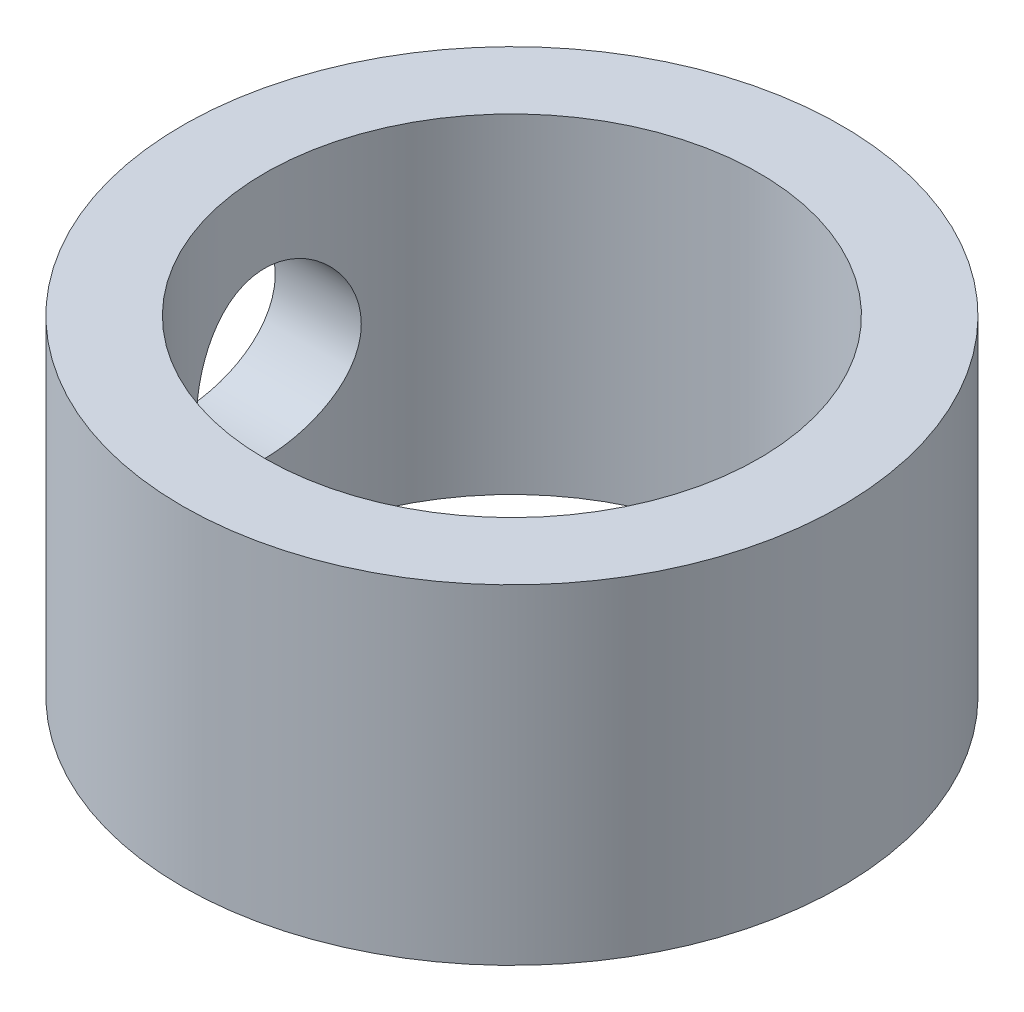
ISO-10303-21;
HEADER;
FILE_DESCRIPTION(('STEP AP214'),'2;1');
FILE_NAME('part.step','',(''),(''),'','','');
FILE_SCHEMA(('AUTOMOTIVE_DESIGN { 1 0 10303 214 1 1 1 1 }'));
ENDSEC;
DATA;
#1=APPLICATION_CONTEXT('core data for automotive mechanical design processes');
#2=APPLICATION_PROTOCOL_DEFINITION('international standard','automotive_design',2000,#1);
#3=PRODUCT_CONTEXT('',#1,'mechanical');
#4=PRODUCT('Part','Part','',(#3));
#5=PRODUCT_RELATED_PRODUCT_CATEGORY('part','',(#4));
#6=PRODUCT_DEFINITION_FORMATION('','',#4);
#7=PRODUCT_DEFINITION_CONTEXT('part definition',#1,'design');
#8=PRODUCT_DEFINITION('design','',#6,#7);
#9=PRODUCT_DEFINITION_SHAPE('','',#8);
#10=(LENGTH_UNIT() NAMED_UNIT(*) SI_UNIT(.MILLI.,.METRE.));
#11=(NAMED_UNIT(*) PLANE_ANGLE_UNIT() SI_UNIT($,.RADIAN.));
#12=(NAMED_UNIT(*) SI_UNIT($,.STERADIAN.) SOLID_ANGLE_UNIT());
#13=UNCERTAINTY_MEASURE_WITH_UNIT(LENGTH_MEASURE(1.E-05),#10,'distance_accuracy_value','');
#14=(GEOMETRIC_REPRESENTATION_CONTEXT(3) GLOBAL_UNCERTAINTY_ASSIGNED_CONTEXT((#13)) GLOBAL_UNIT_ASSIGNED_CONTEXT((#10,
#11,#12)) REPRESENTATION_CONTEXT('',''));
#15=CARTESIAN_POINT('',(0.,0.,0.));
#16=DIRECTION('',(0.,0.,1.));
#17=DIRECTION('',(1.,0.,0.));
#18=AXIS2_PLACEMENT_3D('',#15,#16,#17);
#19=CARTESIAN_POINT('',(0.,2.,0.));
#20=DIRECTION('',(0.,1.,0.));
#21=DIRECTION('',(0.,0.,1.));
#22=AXIS2_PLACEMENT_3D('',#19,#20,#21);
#23=PLANE('',#22);
#24=CARTESIAN_POINT('',(0.,2.,0.));
#25=DIRECTION('',(0.,1.,0.));
#26=DIRECTION('',(0.,0.,1.));
#27=AXIS2_PLACEMENT_3D('',#24,#25,#26);
#28=CIRCLE('',#27,4.);
#29=CARTESIAN_POINT('',(0.,2.,4.));
#30=VERTEX_POINT('',#29);
#31=EDGE_CURVE('E10',#30,#30,#28,.T.);
#32=ORIENTED_EDGE('',*,*,#31,.T.);
#33=EDGE_LOOP('',(#32));
#34=FACE_BOUND('',#33,.T.);
#35=CARTESIAN_POINT('',(0.,2.,0.));
#36=DIRECTION('',(0.,1.,0.));
#37=DIRECTION('',(0.,0.,1.));
#38=AXIS2_PLACEMENT_3D('',#35,#36,#37);
#39=CIRCLE('',#38,3.);
#40=CARTESIAN_POINT('',(0.,2.,3.));
#41=VERTEX_POINT('',#40);
#42=EDGE_CURVE('E58',#41,#41,#39,.T.);
#43=ORIENTED_EDGE('',*,*,#42,.F.);
#44=EDGE_LOOP('',(#43));
#45=FACE_BOUND('',#44,.T.);
#46=ADVANCED_FACE('F37',(#34,#45),#23,.T.);
#47=CARTESIAN_POINT('',(0.,-2.,0.));
#48=DIRECTION('',(0.,1.,0.));
#49=DIRECTION('',(0.,0.,1.));
#50=AXIS2_PLACEMENT_3D('',#47,#48,#49);
#51=PLANE('',#50);
#52=CARTESIAN_POINT('',(0.,-2.,0.));
#53=DIRECTION('',(0.,1.,0.));
#54=DIRECTION('',(0.,0.,1.));
#55=AXIS2_PLACEMENT_3D('',#52,#53,#54);
#56=CIRCLE('',#55,4.);
#57=CARTESIAN_POINT('',(0.,-2.,4.));
#58=VERTEX_POINT('',#57);
#59=EDGE_CURVE('E52',#58,#58,#56,.T.);
#60=ORIENTED_EDGE('',*,*,#59,.F.);
#61=EDGE_LOOP('',(#60));
#62=FACE_BOUND('',#61,.T.);
#63=CARTESIAN_POINT('',(0.,-2.,0.));
#64=DIRECTION('',(0.,1.,0.));
#65=DIRECTION('',(0.,0.,1.));
#66=AXIS2_PLACEMENT_3D('',#63,#64,#65);
#67=CIRCLE('',#66,3.);
#68=CARTESIAN_POINT('',(0.,-2.,3.));
#69=VERTEX_POINT('',#68);
#70=EDGE_CURVE('E60',#69,#69,#67,.T.);
#71=ORIENTED_EDGE('',*,*,#70,.T.);
#72=EDGE_LOOP('',(#71));
#73=FACE_BOUND('',#72,.T.);
#74=ADVANCED_FACE('F84',(#62,#73),#51,.F.);
#75=CARTESIAN_POINT('',(0.,2.,0.));
#76=DIRECTION('',(0.,-1.,0.));
#77=DIRECTION('',(0.,0.,-1.));
#78=AXIS2_PLACEMENT_3D('',#75,#76,#77);
#79=CYLINDRICAL_SURFACE('',#78,4.);
#80=CARTESIAN_POINT('',(-3.87298334620742,0.,-1.));
#81=CARTESIAN_POINT('',(-3.87298440057185,0.0552203003567855,-0.999998431438699));
#82=CARTESIAN_POINT('',(-3.87417722499278,0.11045795943136,-0.995410498208069));
#83=CARTESIAN_POINT('',(-3.87880744892249,0.219347031232613,-0.977209250194446));
#84=CARTESIAN_POINT('',(-3.8822461547418,0.272997501779965,-0.963590682698077));
#85=CARTESIAN_POINT('',(-3.89095489813012,0.377121415287838,-0.927796479849635));
#86=CARTESIAN_POINT('',(-3.8962225706936,0.427598862157759,-0.905631891140943));
#87=CARTESIAN_POINT('',(-3.90799276818327,0.524124341012476,-0.853408456505407));
#88=CARTESIAN_POINT('',(-3.91449534553241,0.570172184831147,-0.823349275424505));
#89=CARTESIAN_POINT('',(-3.92816286540368,0.657544658105845,-0.755483370924517));
#90=CARTESIAN_POINT('',(-3.93533839048709,0.698757440140276,-0.717534755081557));
#91=CARTESIAN_POINT('',(-3.94945150206622,0.774304557743878,-0.635272825640328));
#92=CARTESIAN_POINT('',(-3.95638906626691,0.808638250248629,-0.59095891767214));
#93=CARTESIAN_POINT('',(-3.96936166208095,0.869910187052581,-0.496458080431565));
#94=CARTESIAN_POINT('',(-3.975382749602,0.896738555264605,-0.446197830478044));
#95=CARTESIAN_POINT('',(-3.9857232477043,0.941523857661214,-0.34170527371711));
#96=CARTESIAN_POINT('',(-3.99004290933747,0.959482100766201,-0.287473554316777));
#97=CARTESIAN_POINT('',(-3.99641903539262,0.985659133831439,-0.177743503501663));
#98=CARTESIAN_POINT('',(-3.99851957537723,0.994067857730634,-0.12229308781959));
#99=CARTESIAN_POINT('',(-4.00037437642922,1.00150335171022,-0.0107315277051083));
#100=CARTESIAN_POINT('',(-4.00012898438682,1.00053150888384,0.0453795178152271));
#101=CARTESIAN_POINT('',(-3.99735237981413,0.989370059899943,0.155352247172387));
#102=CARTESIAN_POINT('',(-3.99487200936349,0.979385469978458,0.209236215601067));
#103=CARTESIAN_POINT('',(-3.98796334609942,0.9508114919806,0.314538247413686));
#104=CARTESIAN_POINT('',(-3.98353494959376,0.932221645849036,0.365956179370438));
#105=CARTESIAN_POINT('',(-3.97315003880358,0.886798971725174,0.465406703501806));
#106=CARTESIAN_POINT('',(-3.96718007878021,0.859893182135301,0.513404509766504));
#107=CARTESIAN_POINT('',(-3.9543596152386,0.798657728353497,0.604275622340489));
#108=CARTESIAN_POINT('',(-3.94750895860996,0.764326772575752,0.647148035085505));
#109=CARTESIAN_POINT('',(-3.93345485507808,0.68811650320705,0.727774035084956));
#110=CARTESIAN_POINT('',(-3.92624687810367,0.646058043060891,0.765357679075199));
#111=CARTESIAN_POINT('',(-3.91246017406683,0.556160010583899,0.832976375963018));
#112=CARTESIAN_POINT('',(-3.90588147642388,0.5083201682036,0.863011076046016));
#113=CARTESIAN_POINT('',(-3.89408198732659,0.407883986340414,0.914788129022598));
#114=CARTESIAN_POINT('',(-3.88886793490288,0.355265707874722,0.936489566970491));
#115=CARTESIAN_POINT('',(-3.88047456055983,0.246965812769419,0.970685620636341));
#116=CARTESIAN_POINT('',(-3.87729480324087,0.191284854406746,0.98318220655291));
#117=CARTESIAN_POINT('',(-3.87342142415656,0.0800161993907517,0.998331855466071));
#118=CARTESIAN_POINT('',(-3.87266435637459,0.0244648826681484,1.00123618956785));
#119=CARTESIAN_POINT('',(-3.87354937392416,-0.0863287746312632,0.997806796206219));
#120=CARTESIAN_POINT('',(-3.87519123840506,-0.141571143180496,0.99147391913952));
#121=CARTESIAN_POINT('',(-3.88062832781824,-0.249245705981882,0.969970185575065));
#122=CARTESIAN_POINT('',(-3.8843878809375,-0.301709090628337,0.954945627312698));
#123=CARTESIAN_POINT('',(-3.89360287308385,-0.403372583140673,0.916647232668248));
#124=CARTESIAN_POINT('',(-3.89905851299445,-0.452572303622136,0.893372419085018));
#125=CARTESIAN_POINT('',(-3.91118454837305,-0.54737651114694,0.838708267174623));
#126=CARTESIAN_POINT('',(-3.91787667442657,-0.592891536017241,0.807168701534251));
#127=CARTESIAN_POINT('',(-3.93166833228686,-0.678075345120541,0.737060292934456));
#128=CARTESIAN_POINT('',(-3.93876793091388,-0.71774316666003,0.698490294805439));
#129=CARTESIAN_POINT('',(-3.95278961212643,-0.791124417028383,0.614262720984726));
#130=CARTESIAN_POINT('',(-3.95970280824734,-0.824664025019525,0.568451952531593));
#131=CARTESIAN_POINT('',(-3.97238886645494,-0.883574346780497,0.471702682694676));
#132=CARTESIAN_POINT('',(-3.97816178801584,-0.908945486643282,0.420764448957591));
#133=CARTESIAN_POINT('',(-3.98788046295326,-0.950578413811172,0.31555820173109));
#134=CARTESIAN_POINT('',(-3.99183932008964,-0.966905713751624,0.261317381027881));
#135=CARTESIAN_POINT('',(-3.99754117358315,-0.990184133843367,0.150749760318808));
#136=CARTESIAN_POINT('',(-3.99928459757363,-0.99713706349562,0.0944233650412436));
#137=CARTESIAN_POINT('',(-4.00034169408811,-1.00136758957553,-0.0170835264433264));
#138=CARTESIAN_POINT('',(-3.99971978880008,-0.99890170909539,-0.0722538269660333));
#139=CARTESIAN_POINT('',(-3.99625896457423,-0.984952172705668,-0.18136749641474));
#140=CARTESIAN_POINT('',(-3.99342011157094,-0.973468784986897,-0.235310901780887));
#141=CARTESIAN_POINT('',(-3.98585432853963,-0.941947780229073,-0.340171035644816));
#142=CARTESIAN_POINT('',(-3.98113764502669,-0.921956546685376,-0.391102494581019));
#143=CARTESIAN_POINT('',(-3.97031288913382,-0.874029420980673,-0.488917053041468));
#144=CARTESIAN_POINT('',(-3.96420464137727,-0.846092527330431,-0.53579964126505));
#145=CARTESIAN_POINT('',(-3.95107249681342,-0.782284766002929,-0.6254019284239));
#146=CARTESIAN_POINT('',(-3.94403016945646,-0.746239857092633,-0.667994988300587));
#147=CARTESIAN_POINT('',(-3.92990649053207,-0.667577148026192,-0.746615020271252));
#148=CARTESIAN_POINT('',(-3.92282512952424,-0.624957683902056,-0.782640325068178));
#149=CARTESIAN_POINT('',(-3.90927475860683,-0.533398585798706,-0.84776202647924));
#150=CARTESIAN_POINT('',(-3.90281963730391,-0.484355876587518,-0.876716619446593));
#151=CARTESIAN_POINT('',(-3.8914395555011,-0.381944510077153,-0.925926896615622));
#152=CARTESIAN_POINT('',(-3.88651348244814,-0.328579033892714,-0.946188909759556));
#153=CARTESIAN_POINT('',(-3.87951908741315,-0.229422988173725,-0.974422528565571));
#154=CARTESIAN_POINT('',(-3.87708663005761,-0.184106835617641,-0.983993170595829));
#155=CARTESIAN_POINT('',(-3.87381838580358,-0.0925311309985344,-0.996782292572819));
#156=CARTESIAN_POINT('',(-3.87298246270639,-0.0462716597493715,-1.00000131437052));
#157=CARTESIAN_POINT('',(-3.87298334620742,0.,-1.));
#158=B_SPLINE_CURVE_WITH_KNOTS('',3,(#80,#81,#82,#83,#84,#85,#86,#87,#88,#89,#90,#91,#92,#93,
#94,#95,#96,#97,#98,#99,#100,#101,#102,#103,#104,#105,#106,#107,#108,#109,#110,#111,#112,#113,
#114,#115,#116,#117,#118,#119,#120,#121,#122,#123,#124,#125,#126,#127,#128,#129,#130,#131,#132,
#133,#134,#135,#136,#137,#138,#139,#140,#141,#142,#143,#144,#145,#146,#147,#148,#149,#150,#151,
#152,#153,#154,#155,#156,#157),.UNSPECIFIED.,.T.,.F.,(4,2,2,2,2,2,2,2,2,2,2,2,2,2,2,2,2,2,2,2,2,
2,2,2,2,2,2,2,2,2,2,2,2,2,2,2,2,2,4),(0.,0.16549097667523,0.331078296534211,0.496452290829153,
0.661833306984659,0.830495816734649,0.999174085882211,1.17020598555442,1.34121263935111,
1.50875500394413,1.67627259462683,1.84007305071853,2.00388222686189,2.16917149698052,
2.3344895418384,2.50428186625039,2.67408212476195,2.84470572799635,3.01529280048093,
3.18137429900961,3.34744050869795,3.51078961999957,3.67415808564841,3.84073138339937,
4.00733207550292,4.17810132382402,4.34886166284096,4.51836829119046,4.6878421955989,
4.85273378447257,5.01762046947067,5.18161950620159,5.34563922291503,5.51358838629103,
5.68158012622478,5.85270590910145,6.02370688542922,6.16239130867206,6.30106390036083),.UNSPECIFIED.);
#159=CARTESIAN_POINT('',(-3.87298334620742,0.,-1.));
#160=VERTEX_POINT('',#159);
#161=EDGE_CURVE('E64',#160,#160,#158,.T.);
#162=ORIENTED_EDGE('',*,*,#161,.T.);
#163=EDGE_LOOP('',(#162));
#164=FACE_BOUND('',#163,.T.);
#165=ORIENTED_EDGE('',*,*,#31,.F.);
#166=EDGE_LOOP('',(#165));
#167=FACE_BOUND('',#166,.T.);
#168=ORIENTED_EDGE('',*,*,#59,.T.);
#169=EDGE_LOOP('',(#168));
#170=FACE_BOUND('',#169,.T.);
#171=ADVANCED_FACE('F39',(#164,#167,#170),#79,.T.);
#172=CARTESIAN_POINT('',(0.,2.,0.));
#173=DIRECTION('',(0.,-1.,0.));
#174=DIRECTION('',(0.,0.,-1.));
#175=AXIS2_PLACEMENT_3D('',#172,#173,#174);
#176=CYLINDRICAL_SURFACE('',#175,3.);
#177=CARTESIAN_POINT('',(-2.82842712474619,0.,-1.));
#178=CARTESIAN_POINT('',(-2.82842694532735,0.0544681748106766,-1.0000002579478));
#179=CARTESIAN_POINT('',(-2.83001769372806,0.108934799771525,-0.99553478369814));
#180=CARTESIAN_POINT('',(-2.8361757417458,0.216254420950616,-0.977851131702564));
#181=CARTESIAN_POINT('',(-2.8407435316722,0.269107149863937,-0.964631512170673));
#182=CARTESIAN_POINT('',(-2.85228203663888,0.371626893012813,-0.929955485680262));
#183=CARTESIAN_POINT('',(-2.8592480396464,0.421299929446882,-0.908515221402));
#184=CARTESIAN_POINT('',(-2.87479122017008,0.516360048543795,-0.858061628442627));
#185=CARTESIAN_POINT('',(-2.88336875305432,0.561746182552497,-0.829046628860522));
#186=CARTESIAN_POINT('',(-2.90154489405589,0.648719962339488,-0.763051146442527));
#187=CARTESIAN_POINT('',(-2.91116894844139,0.690115428672043,-0.725824341377825));
#188=CARTESIAN_POINT('',(-2.93013864801508,0.766206801224324,-0.644987667214489));
#189=CARTESIAN_POINT('',(-2.93948424829099,0.800901631582284,-0.601376775052401));
#190=CARTESIAN_POINT('',(-2.95713866921658,0.863478897329681,-0.507604507964984));
#191=CARTESIAN_POINT('',(-2.96541407701568,0.891159970617982,-0.457301911224518));
#192=CARTESIAN_POINT('',(-2.97969586771021,0.937591585127487,-0.352431222987481));
#193=CARTESIAN_POINT('',(-2.98570286203012,0.9563445331769,-0.297864285687214));
#194=CARTESIAN_POINT('',(-2.99459075431897,0.983735854632399,-0.188028817433493));
#195=CARTESIAN_POINT('',(-2.99757314777558,0.992703446257007,-0.132850754852967));
#196=CARTESIAN_POINT('',(-3.00043608218249,1.00131629336066,-0.0216978748240912));
#197=CARTESIAN_POINT('',(-3.00031742262891,1.00096395165242,0.0342767335438928));
#198=CARTESIAN_POINT('',(-2.99706039618736,0.991155745433967,0.143103515193817));
#199=CARTESIAN_POINT('',(-2.99404064755135,0.982057471525493,0.195992048591667));
#200=CARTESIAN_POINT('',(-2.98546967339714,0.955607019019546,0.299443438822161));
#201=CARTESIAN_POINT('',(-2.97991827631115,0.938254281020245,0.350006137779175));
#202=CARTESIAN_POINT('',(-2.96675670293292,0.895578682693871,0.448152474842013));
#203=CARTESIAN_POINT('',(-2.9591204252427,0.870154061453222,0.495688220968998));
#204=CARTESIAN_POINT('',(-2.94258393038665,0.81214029455161,0.585924325527169));
#205=CARTESIAN_POINT('',(-2.93368336200518,0.779549156673362,0.628623334384769));
#206=CARTESIAN_POINT('',(-2.9150619185089,0.706325606539263,0.710100866551906));
#207=CARTESIAN_POINT('',(-2.90532215172667,0.665386842154559,0.748600157067556));
#208=CARTESIAN_POINT('',(-2.88647335245111,0.577551274277343,0.81827725959589));
#209=CARTESIAN_POINT('',(-2.8773644173145,0.530653554286762,0.849453943273005));
#210=CARTESIAN_POINT('',(-2.86070525135531,0.431346374384585,0.903987455042732));
#211=CARTESIAN_POINT('',(-2.85317909338821,0.378867868632188,0.927226463651049));
#212=CARTESIAN_POINT('',(-2.84081650878299,0.270428605733738,0.964443193299507));
#213=CARTESIAN_POINT('',(-2.83597895501223,0.214469318778176,0.978424795755529));
#214=CARTESIAN_POINT('',(-2.8297963630207,0.103361644599381,0.996161282090474));
#215=CARTESIAN_POINT('',(-2.82830360315139,0.048290575254276,1.00034909550575));
#216=CARTESIAN_POINT('',(-2.828566720628,-0.0617761491170376,0.999605438911604));
#217=CARTESIAN_POINT('',(-2.83032200792768,-0.116771816024761,0.99467562522726));
#218=CARTESIAN_POINT('',(-2.83673618089379,-0.223156965711163,0.97622565155183));
#219=CARTESIAN_POINT('',(-2.84129325440593,-0.27460543015064,0.963006393980555));
#220=CARTESIAN_POINT('',(-2.8526855367127,-0.374543606239384,0.928713862560596));
#221=CARTESIAN_POINT('',(-2.85952114934907,-0.423032791590834,0.907639196363457));
#222=CARTESIAN_POINT('',(-2.87496877595718,-0.517380420846942,0.857474340738901));
#223=CARTESIAN_POINT('',(-2.8836302566561,-0.563106642641786,0.828151118358487));
#224=CARTESIAN_POINT('',(-2.90165768730984,-0.649146052383734,0.762585630557568));
#225=CARTESIAN_POINT('',(-2.911023844438,-0.689457638661223,0.726341325498785));
#226=CARTESIAN_POINT('',(-2.92995038637844,-0.765527984090634,0.645891705900323));
#227=CARTESIAN_POINT('',(-2.93949843577895,-0.800974390018848,0.601387270546652));
#228=CARTESIAN_POINT('',(-2.9572685161311,-0.863916142348044,0.506827291400258));
#229=CARTESIAN_POINT('',(-2.96549059417695,-0.891411771162425,0.456771944864553));
#230=CARTESIAN_POINT('',(-2.97964405810603,-0.937420104861714,0.352779862432296));
#231=CARTESIAN_POINT('',(-2.98559030004531,-0.955991277148065,0.298871123321197));
#232=CARTESIAN_POINT('',(-2.99458610837774,-0.983727742060104,0.188458465846017));
#233=CARTESIAN_POINT('',(-2.99763672034018,-0.992896429880503,0.13195549195389));
#234=CARTESIAN_POINT('',(-3.00041863236257,-1.00126207760564,0.0208153358600409));
#235=CARTESIAN_POINT('',(-3.00029920089441,-1.00090745393238,-0.0337847239200188));
#236=CARTESIAN_POINT('',(-2.99712196519396,-0.991342691853593,-0.142111145000173));
#237=CARTESIAN_POINT('',(-2.99406439933567,-0.982133271847236,-0.195837576819055));
#238=CARTESIAN_POINT('',(-2.98540914954421,-0.955417765424032,-0.30004211943206));
#239=CARTESIAN_POINT('',(-2.9798525836118,-0.938045784647048,-0.350558270912795));
#240=CARTESIAN_POINT('',(-2.96677160704464,-0.895622468902864,-0.447978350939789));
#241=CARTESIAN_POINT('',(-2.95924684047901,-0.870569744803058,-0.494881624142409));
#242=CARTESIAN_POINT('',(-2.94265868828001,-0.812430487897919,-0.585634016308809));
#243=CARTESIAN_POINT('',(-2.93354872492381,-0.77908131461808,-0.629306251557696));
#244=CARTESIAN_POINT('',(-2.91492988791425,-0.705742608844085,-0.710581026272338));
#245=CARTESIAN_POINT('',(-2.90542088771397,-0.665750957738318,-0.748181621624259));
#246=CARTESIAN_POINT('',(-2.88663279827365,-0.578390644411965,-0.817741808833464));
#247=CARTESIAN_POINT('',(-2.87737727995345,-0.530794489019232,-0.849422965999216));
#248=CARTESIAN_POINT('',(-2.86060193316303,-0.430665573101348,-0.904314343299799));
#249=CARTESIAN_POINT('',(-2.8530816513617,-0.378134106985756,-0.927526776814559));
#250=CARTESIAN_POINT('',(-2.84101334230535,-0.272038175976167,-0.963843828206626));
#251=CARTESIAN_POINT('',(-2.83634632944799,-0.218627736434278,-0.977357909163268));
#252=CARTESIAN_POINT('',(-2.8300538361394,-0.110143949484525,-0.995434320161694));
#253=CARTESIAN_POINT('',(-2.82842730615135,-0.0550711825642514,-0.999999739196501));
#254=CARTESIAN_POINT('',(-2.82842712474619,0.,-1.));
#255=B_SPLINE_CURVE_WITH_KNOTS('',3,(#177,#178,#179,#180,#181,#182,#183,#184,#185,#186,#187,
#188,#189,#190,#191,#192,#193,#194,#195,#196,#197,#198,#199,#200,#201,#202,#203,#204,#205,#206,
#207,#208,#209,#210,#211,#212,#213,#214,#215,#216,#217,#218,#219,#220,#221,#222,#223,#224,#225,
#226,#227,#228,#229,#230,#231,#232,#233,#234,#235,#236,#237,#238,#239,#240,#241,#242,#243,#244,
#245,#246,#247,#248,#249,#250,#251,#252,#253,#254),.UNSPECIFIED.,.T.,.F.,(4,2,2,2,2,2,2,2,2,2,2,
2,2,2,2,2,2,2,2,2,2,2,2,2,2,2,2,2,2,2,2,2,2,2,2,2,2,2,4),(0.,0.163200584775417,0.32642805496888,
0.489336627454544,0.652281166139158,0.821013374229397,0.989772651673596,1.16293506139029,
1.33605076382161,1.50314318760306,1.67019253297699,1.83069004820941,1.99119844184608,
2.15381654855707,2.31647991869394,2.48680174359289,2.65714979607477,2.82992639837376,
3.00263051349688,3.16754291357512,3.33242535830307,3.49164395761849,3.65089079140018,
3.81518857728788,3.979534856552,4.15178808164165,4.32403518750605,4.49513791183924,
4.66617882997229,4.82918084670708,4.99216964002854,5.15256956033502,5.31299850756315,
5.47935519513706,5.64576504425704,5.81868902729217,5.99156778259939,6.15663212153685,
6.32163947179229),.UNSPECIFIED.);
#256=CARTESIAN_POINT('',(-2.82842712474619,0.,-1.));
#257=VERTEX_POINT('',#256);
#258=EDGE_CURVE('E42',#257,#257,#255,.T.);
#259=ORIENTED_EDGE('',*,*,#258,.F.);
#260=EDGE_LOOP('',(#259));
#261=FACE_BOUND('',#260,.T.);
#262=ORIENTED_EDGE('',*,*,#42,.T.);
#263=EDGE_LOOP('',(#262));
#264=FACE_BOUND('',#263,.T.);
#265=ORIENTED_EDGE('',*,*,#70,.F.);
#266=EDGE_LOOP('',(#265));
#267=FACE_BOUND('',#266,.T.);
#268=ADVANCED_FACE('F76',(#261,#264,#267),#176,.F.);
#269=CARTESIAN_POINT('',(-5.,0.,0.));
#270=DIRECTION('',(1.,0.,0.));
#271=DIRECTION('',(0.,0.,-1.));
#272=AXIS2_PLACEMENT_3D('',#269,#270,#271);
#273=CYLINDRICAL_SURFACE('',#272,1.);
#274=ORIENTED_EDGE('',*,*,#258,.T.);
#275=EDGE_LOOP('',(#274));
#276=FACE_BOUND('',#275,.T.);
#277=ORIENTED_EDGE('',*,*,#161,.F.);
#278=EDGE_LOOP('',(#277));
#279=FACE_BOUND('',#278,.T.);
#280=ADVANCED_FACE('F73',(#276,#279),#273,.F.);
#281=CLOSED_SHELL('',(#46,#74,#171,#268,#280));
#282=MANIFOLD_SOLID_BREP('B2',#281);
#283=ADVANCED_BREP_SHAPE_REPRESENTATION('',(#18,#282),#14);
#284=SHAPE_DEFINITION_REPRESENTATION(#9,#283);
ENDSEC;
END-ISO-10303-21;
